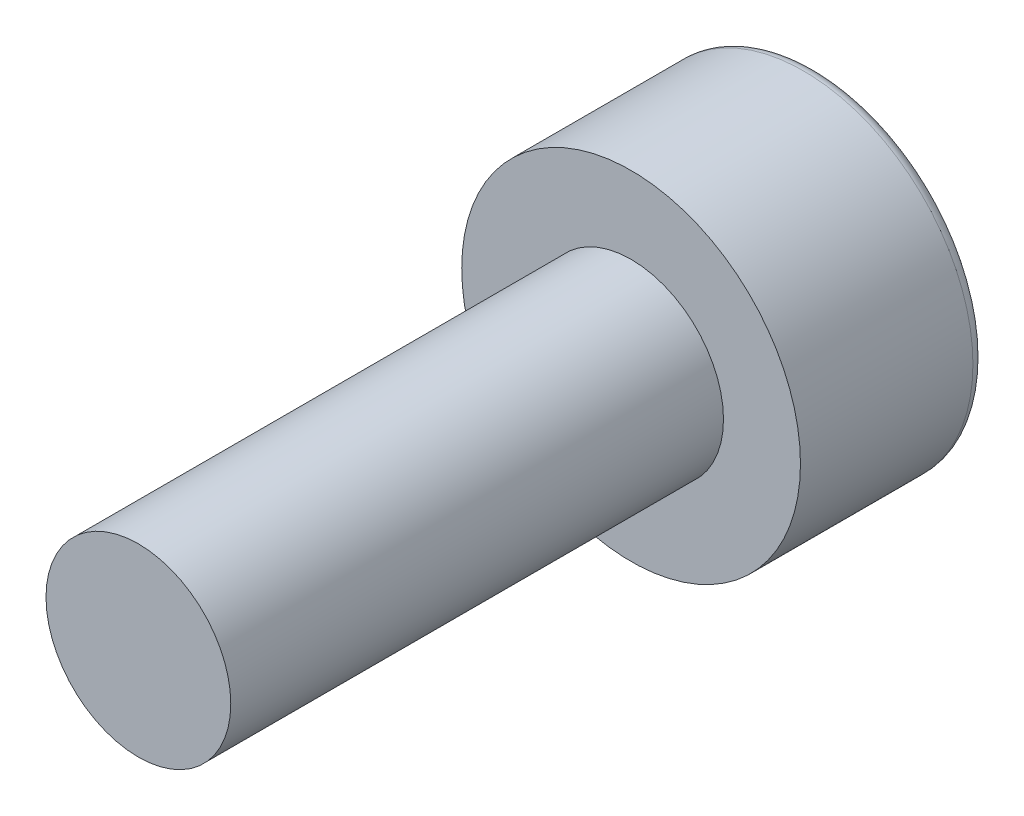
ISO-10303-21;
HEADER;
FILE_DESCRIPTION(('STEP AP214'),'2;1');
FILE_NAME('part.step','',(''),(''),'','','');
FILE_SCHEMA(('AUTOMOTIVE_DESIGN { 1 0 10303 214 1 1 1 1 }'));
ENDSEC;
DATA;
#1=APPLICATION_CONTEXT('core data for automotive mechanical design processes');
#2=APPLICATION_PROTOCOL_DEFINITION('international standard','automotive_design',2000,#1);
#3=PRODUCT_CONTEXT('',#1,'mechanical');
#4=PRODUCT('Part','Part','',(#3));
#5=PRODUCT_RELATED_PRODUCT_CATEGORY('part','',(#4));
#6=PRODUCT_DEFINITION_FORMATION('','',#4);
#7=PRODUCT_DEFINITION_CONTEXT('part definition',#1,'design');
#8=PRODUCT_DEFINITION('design','',#6,#7);
#9=PRODUCT_DEFINITION_SHAPE('','',#8);
#10=(LENGTH_UNIT() NAMED_UNIT(*) SI_UNIT(.MILLI.,.METRE.));
#11=(NAMED_UNIT(*) PLANE_ANGLE_UNIT() SI_UNIT($,.RADIAN.));
#12=(NAMED_UNIT(*) SI_UNIT($,.STERADIAN.) SOLID_ANGLE_UNIT());
#13=UNCERTAINTY_MEASURE_WITH_UNIT(LENGTH_MEASURE(1.E-05),#10,'distance_accuracy_value','');
#14=(GEOMETRIC_REPRESENTATION_CONTEXT(3) GLOBAL_UNCERTAINTY_ASSIGNED_CONTEXT((#13)) GLOBAL_UNIT_ASSIGNED_CONTEXT((#10,
#11,#12)) REPRESENTATION_CONTEXT('',''));
#15=CARTESIAN_POINT('',(0.,0.,0.));
#16=DIRECTION('',(0.,0.,1.));
#17=DIRECTION('',(1.,0.,0.));
#18=AXIS2_PLACEMENT_3D('',#15,#16,#17);
#19=CARTESIAN_POINT('',(0.,0.,0.));
#20=DIRECTION('',(0.,0.,-1.));
#21=DIRECTION('',(1.,0.,0.));
#22=AXIS2_PLACEMENT_3D('',#19,#20,#21);
#23=PLANE('',#22);
#24=CARTESIAN_POINT('',(0.,0.,0.));
#25=DIRECTION('',(0.,0.,1.));
#26=DIRECTION('',(1.,0.,0.));
#27=AXIS2_PLACEMENT_3D('',#24,#25,#26);
#28=CIRCLE('',#27,2.75);
#29=CARTESIAN_POINT('',(2.75,0.,0.));
#30=VERTEX_POINT('',#29);
#31=EDGE_CURVE('E127',#30,#30,#28,.T.);
#32=ORIENTED_EDGE('',*,*,#31,.T.);
#33=EDGE_LOOP('',(#32));
#34=FACE_BOUND('',#33,.T.);
#35=CARTESIAN_POINT('',(0.,0.,0.));
#36=DIRECTION('',(0.,0.,1.));
#37=DIRECTION('',(1.,0.,0.));
#38=AXIS2_PLACEMENT_3D('',#35,#36,#37);
#39=CIRCLE('',#38,1.5);
#40=CARTESIAN_POINT('',(1.5,0.,0.));
#41=VERTEX_POINT('',#40);
#42=EDGE_CURVE('E130',#41,#41,#39,.F.);
#43=ORIENTED_EDGE('',*,*,#42,.T.);
#44=EDGE_LOOP('',(#43));
#45=FACE_BOUND('',#44,.T.);
#46=ADVANCED_FACE('F37',(#34,#45),#23,.F.);
#47=CARTESIAN_POINT('',(0.,0.,-3.));
#48=DIRECTION('',(0.,0.,1.));
#49=DIRECTION('',(-1.,0.,0.));
#50=AXIS2_PLACEMENT_3D('',#47,#48,#49);
#51=CYLINDRICAL_SURFACE('',#50,2.75);
#52=CARTESIAN_POINT('',(0.,0.,-2.8));
#53=DIRECTION('',(0.,0.,1.));
#54=DIRECTION('',(1.,0.,0.));
#55=AXIS2_PLACEMENT_3D('',#52,#53,#54);
#56=CIRCLE('',#55,2.75);
#57=CARTESIAN_POINT('',(2.75,0.,-2.8));
#58=VERTEX_POINT('',#57);
#59=EDGE_CURVE('E11',#58,#58,#56,.F.);
#60=ORIENTED_EDGE('',*,*,#59,.F.);
#61=EDGE_LOOP('',(#60));
#62=FACE_BOUND('',#61,.T.);
#63=ORIENTED_EDGE('',*,*,#31,.F.);
#64=EDGE_LOOP('',(#63));
#65=FACE_BOUND('',#64,.T.);
#66=ADVANCED_FACE('F140',(#62,#65),#51,.T.);
#67=CARTESIAN_POINT('',(0.,0.,-3.));
#68=DIRECTION('',(0.,0.,-1.));
#69=DIRECTION('',(1.,0.,0.));
#70=AXIS2_PLACEMENT_3D('',#67,#68,#69);
#71=PLANE('',#70);
#72=CARTESIAN_POINT('',(0.,0.,-3.));
#73=DIRECTION('',(0.,0.,1.));
#74=DIRECTION('',(1.,0.,0.));
#75=AXIS2_PLACEMENT_3D('',#72,#73,#74);
#76=CIRCLE('',#75,2.55);
#77=CARTESIAN_POINT('',(2.55,0.,-3.));
#78=VERTEX_POINT('',#77);
#79=EDGE_CURVE('E45',#78,#78,#76,.T.);
#80=ORIENTED_EDGE('',*,*,#79,.F.);
#81=EDGE_LOOP('',(#80));
#82=FACE_BOUND('',#81,.T.);
#83=DIRECTION('',(0.258819045102521,-0.965925826289068,0.));
#84=VECTOR('',#83,1.);
#85=CARTESIAN_POINT('',(-1.39419383956301,0.373573113403356,-3.));
#86=LINE('',#85,#84);
#87=CARTESIAN_POINT('',(-1.39419383956301,0.373573113403356,-3.));
#88=VERTEX_POINT('',#87);
#89=CARTESIAN_POINT('',(-1.02062072615966,-1.02062072615966,-3.));
#90=VERTEX_POINT('',#89);
#91=EDGE_CURVE('E144',#88,#90,#86,.T.);
#92=ORIENTED_EDGE('',*,*,#91,.T.);
#93=DIRECTION('',(0.965925826289068,-0.258819045102521,0.));
#94=VECTOR('',#93,1.);
#95=CARTESIAN_POINT('',(-1.02062072615966,-1.02062072615966,-3.));
#96=LINE('',#95,#94);
#97=CARTESIAN_POINT('',(0.373573113403355,-1.39419383956301,-3.));
#98=VERTEX_POINT('',#97);
#99=EDGE_CURVE('E146',#90,#98,#96,.T.);
#100=ORIENTED_EDGE('',*,*,#99,.T.);
#101=DIRECTION('',(0.707106781186548,0.707106781186548,0.));
#102=VECTOR('',#101,1.);
#103=CARTESIAN_POINT('',(0.373573113403355,-1.39419383956301,-3.));
#104=LINE('',#103,#102);
#105=CARTESIAN_POINT('',(1.39419383956301,-0.373573113403355,-3.));
#106=VERTEX_POINT('',#105);
#107=EDGE_CURVE('E150',#98,#106,#104,.T.);
#108=ORIENTED_EDGE('',*,*,#107,.T.);
#109=DIRECTION('',(-0.258819045102521,0.965925826289068,0.));
#110=VECTOR('',#109,1.);
#111=CARTESIAN_POINT('',(1.39419383956301,-0.373573113403355,-3.));
#112=LINE('',#111,#110);
#113=CARTESIAN_POINT('',(1.02062072615966,1.02062072615966,-3.));
#114=VERTEX_POINT('',#113);
#115=EDGE_CURVE('E157',#106,#114,#112,.T.);
#116=ORIENTED_EDGE('',*,*,#115,.T.);
#117=DIRECTION('',(-0.965925826289068,0.258819045102521,0.));
#118=VECTOR('',#117,1.);
#119=CARTESIAN_POINT('',(1.02062072615966,1.02062072615966,-3.));
#120=LINE('',#119,#118);
#121=CARTESIAN_POINT('',(-0.373573113403355,1.39419383956301,-3.));
#122=VERTEX_POINT('',#121);
#123=EDGE_CURVE('E116',#114,#122,#120,.T.);
#124=ORIENTED_EDGE('',*,*,#123,.T.);
#125=DIRECTION('',(-0.707106781186548,-0.707106781186548,0.));
#126=VECTOR('',#125,1.);
#127=CARTESIAN_POINT('',(-0.373573113403355,1.39419383956301,-3.));
#128=LINE('',#127,#126);
#129=EDGE_CURVE('E147',#122,#88,#128,.T.);
#130=ORIENTED_EDGE('',*,*,#129,.T.);
#131=EDGE_LOOP('',(#92,#100,#108,#116,#124,#130));
#132=FACE_BOUND('',#131,.T.);
#133=ADVANCED_FACE('F136',(#82,#132),#71,.T.);
#134=CARTESIAN_POINT('',(-1.39419383956301,0.373573113403356,-1.7));
#135=DIRECTION('',(-0.965925826289068,-0.258819045102521,0.));
#136=DIRECTION('',(0.258819045102521,-0.965925826289068,0.));
#137=AXIS2_PLACEMENT_3D('',#134,#135,#136);
#138=PLANE('',#137);
#139=ORIENTED_EDGE('',*,*,#91,.F.);
#140=DIRECTION('',(0.,0.,-1.));
#141=VECTOR('',#140,1.);
#142=CARTESIAN_POINT('',(-1.39419383956301,0.373573113403356,-1.7));
#143=LINE('',#142,#141);
#144=CARTESIAN_POINT('',(-1.39419383956301,0.373573113403356,-1.7));
#145=VERTEX_POINT('',#144);
#146=EDGE_CURVE('E83',#145,#88,#143,.T.);
#147=ORIENTED_EDGE('',*,*,#146,.F.);
#148=DIRECTION('',(0.258819045102521,-0.965925826289068,0.));
#149=VECTOR('',#148,1.);
#150=CARTESIAN_POINT('',(-1.39419383956301,0.373573113403356,-1.7));
#151=LINE('',#150,#149);
#152=CARTESIAN_POINT('',(-1.02062072615966,-1.02062072615966,-1.7));
#153=VERTEX_POINT('',#152);
#154=EDGE_CURVE('E160',#145,#153,#151,.T.);
#155=ORIENTED_EDGE('',*,*,#154,.T.);
#156=DIRECTION('',(0.,0.,-1.));
#157=VECTOR('',#156,1.);
#158=CARTESIAN_POINT('',(-1.02062072615966,-1.02062072615966,-1.7));
#159=LINE('',#158,#157);
#160=EDGE_CURVE('E52',#153,#90,#159,.T.);
#161=ORIENTED_EDGE('',*,*,#160,.T.);
#162=EDGE_LOOP('',(#139,#147,#155,#161));
#163=FACE_BOUND('',#162,.T.);
#164=ADVANCED_FACE('F139',(#163),#138,.F.);
#165=CARTESIAN_POINT('',(-0.373573113403355,1.39419383956301,-1.7));
#166=DIRECTION('',(-0.707106781186548,0.707106781186548,0.));
#167=DIRECTION('',(-0.707106781186548,-0.707106781186548,0.));
#168=AXIS2_PLACEMENT_3D('',#165,#166,#167);
#169=PLANE('',#168);
#170=ORIENTED_EDGE('',*,*,#129,.F.);
#171=DIRECTION('',(0.,0.,-1.));
#172=VECTOR('',#171,1.);
#173=CARTESIAN_POINT('',(-0.373573113403355,1.39419383956301,-1.7));
#174=LINE('',#173,#172);
#175=CARTESIAN_POINT('',(-0.373573113403355,1.39419383956301,-1.7));
#176=VERTEX_POINT('',#175);
#177=EDGE_CURVE('E118',#176,#122,#174,.T.);
#178=ORIENTED_EDGE('',*,*,#177,.F.);
#179=DIRECTION('',(-0.707106781186548,-0.707106781186548,0.));
#180=VECTOR('',#179,1.);
#181=CARTESIAN_POINT('',(-0.373573113403355,1.39419383956301,-1.7));
#182=LINE('',#181,#180);
#183=EDGE_CURVE('E61',#176,#145,#182,.T.);
#184=ORIENTED_EDGE('',*,*,#183,.T.);
#185=ORIENTED_EDGE('',*,*,#146,.T.);
#186=EDGE_LOOP('',(#170,#178,#184,#185));
#187=FACE_BOUND('',#186,.T.);
#188=ADVANCED_FACE('F189',(#187),#169,.F.);
#189=CARTESIAN_POINT('',(1.02062072615966,1.02062072615966,-1.7));
#190=DIRECTION('',(0.258819045102521,0.965925826289068,0.));
#191=DIRECTION('',(-0.965925826289068,0.258819045102521,0.));
#192=AXIS2_PLACEMENT_3D('',#189,#190,#191);
#193=PLANE('',#192);
#194=ORIENTED_EDGE('',*,*,#123,.F.);
#195=DIRECTION('',(0.,0.,-1.));
#196=VECTOR('',#195,1.);
#197=CARTESIAN_POINT('',(1.02062072615966,1.02062072615966,-1.7));
#198=LINE('',#197,#196);
#199=CARTESIAN_POINT('',(1.02062072615966,1.02062072615966,-1.7));
#200=VERTEX_POINT('',#199);
#201=EDGE_CURVE('E105',#200,#114,#198,.T.);
#202=ORIENTED_EDGE('',*,*,#201,.F.);
#203=DIRECTION('',(-0.965925826289068,0.258819045102521,0.));
#204=VECTOR('',#203,1.);
#205=CARTESIAN_POINT('',(1.02062072615966,1.02062072615966,-1.7));
#206=LINE('',#205,#204);
#207=EDGE_CURVE('E108',#200,#176,#206,.T.);
#208=ORIENTED_EDGE('',*,*,#207,.T.);
#209=ORIENTED_EDGE('',*,*,#177,.T.);
#210=EDGE_LOOP('',(#194,#202,#208,#209));
#211=FACE_BOUND('',#210,.T.);
#212=ADVANCED_FACE('F114',(#211),#193,.F.);
#213=CARTESIAN_POINT('',(1.39419383956301,-0.373573113403355,-1.7));
#214=DIRECTION('',(0.965925826289068,0.258819045102521,0.));
#215=DIRECTION('',(-0.258819045102521,0.965925826289068,0.));
#216=AXIS2_PLACEMENT_3D('',#213,#214,#215);
#217=PLANE('',#216);
#218=ORIENTED_EDGE('',*,*,#115,.F.);
#219=DIRECTION('',(0.,0.,-1.));
#220=VECTOR('',#219,1.);
#221=CARTESIAN_POINT('',(1.39419383956301,-0.373573113403355,-1.7));
#222=LINE('',#221,#220);
#223=CARTESIAN_POINT('',(1.39419383956301,-0.373573113403355,-1.7));
#224=VERTEX_POINT('',#223);
#225=EDGE_CURVE('E107',#224,#106,#222,.T.);
#226=ORIENTED_EDGE('',*,*,#225,.F.);
#227=DIRECTION('',(-0.258819045102521,0.965925826289068,0.));
#228=VECTOR('',#227,1.);
#229=CARTESIAN_POINT('',(1.39419383956301,-0.373573113403355,-1.7));
#230=LINE('',#229,#228);
#231=EDGE_CURVE('E100',#224,#200,#230,.T.);
#232=ORIENTED_EDGE('',*,*,#231,.T.);
#233=ORIENTED_EDGE('',*,*,#201,.T.);
#234=EDGE_LOOP('',(#218,#226,#232,#233));
#235=FACE_BOUND('',#234,.T.);
#236=ADVANCED_FACE('F103',(#235),#217,.F.);
#237=CARTESIAN_POINT('',(0.373573113403355,-1.39419383956301,-1.7));
#238=DIRECTION('',(0.707106781186548,-0.707106781186548,0.));
#239=DIRECTION('',(0.707106781186548,0.707106781186548,0.));
#240=AXIS2_PLACEMENT_3D('',#237,#238,#239);
#241=PLANE('',#240);
#242=ORIENTED_EDGE('',*,*,#107,.F.);
#243=DIRECTION('',(0.,0.,-1.));
#244=VECTOR('',#243,1.);
#245=CARTESIAN_POINT('',(0.373573113403355,-1.39419383956301,-1.7));
#246=LINE('',#245,#244);
#247=CARTESIAN_POINT('',(0.373573113403355,-1.39419383956301,-1.7));
#248=VERTEX_POINT('',#247);
#249=EDGE_CURVE('E121',#248,#98,#246,.T.);
#250=ORIENTED_EDGE('',*,*,#249,.F.);
#251=DIRECTION('',(0.707106781186548,0.707106781186548,0.));
#252=VECTOR('',#251,1.);
#253=CARTESIAN_POINT('',(0.373573113403355,-1.39419383956301,-1.7));
#254=LINE('',#253,#252);
#255=EDGE_CURVE('E109',#248,#224,#254,.T.);
#256=ORIENTED_EDGE('',*,*,#255,.T.);
#257=ORIENTED_EDGE('',*,*,#225,.T.);
#258=EDGE_LOOP('',(#242,#250,#256,#257));
#259=FACE_BOUND('',#258,.T.);
#260=ADVANCED_FACE('F167',(#259),#241,.F.);
#261=CARTESIAN_POINT('',(-1.02062072615966,-1.02062072615966,-1.7));
#262=DIRECTION('',(-0.258819045102521,-0.965925826289068,0.));
#263=DIRECTION('',(0.965925826289068,-0.258819045102521,0.));
#264=AXIS2_PLACEMENT_3D('',#261,#262,#263);
#265=PLANE('',#264);
#266=ORIENTED_EDGE('',*,*,#99,.F.);
#267=ORIENTED_EDGE('',*,*,#160,.F.);
#268=DIRECTION('',(0.965925826289068,-0.258819045102521,0.));
#269=VECTOR('',#268,1.);
#270=CARTESIAN_POINT('',(-1.02062072615966,-1.02062072615966,-1.7));
#271=LINE('',#270,#269);
#272=EDGE_CURVE('E91',#153,#248,#271,.T.);
#273=ORIENTED_EDGE('',*,*,#272,.T.);
#274=ORIENTED_EDGE('',*,*,#249,.T.);
#275=EDGE_LOOP('',(#266,#267,#273,#274));
#276=FACE_BOUND('',#275,.T.);
#277=ADVANCED_FACE('F169',(#276),#265,.F.);
#278=CARTESIAN_POINT('',(0.,0.,-1.7));
#279=DIRECTION('',(0.,0.,-1.));
#280=DIRECTION('',(1.,0.,0.));
#281=AXIS2_PLACEMENT_3D('',#278,#279,#280);
#282=PLANE('',#281);
#283=ORIENTED_EDGE('',*,*,#154,.F.);
#284=ORIENTED_EDGE('',*,*,#183,.F.);
#285=ORIENTED_EDGE('',*,*,#207,.F.);
#286=ORIENTED_EDGE('',*,*,#231,.F.);
#287=ORIENTED_EDGE('',*,*,#255,.F.);
#288=ORIENTED_EDGE('',*,*,#272,.F.);
#289=EDGE_LOOP('',(#283,#284,#285,#286,#287,#288));
#290=FACE_BOUND('',#289,.T.);
#291=ADVANCED_FACE('F111',(#290),#282,.T.);
#292=CARTESIAN_POINT('',(0.,0.,8.));
#293=DIRECTION('',(0.,0.,-1.));
#294=DIRECTION('',(1.,0.,0.));
#295=AXIS2_PLACEMENT_3D('',#292,#293,#294);
#296=CYLINDRICAL_SURFACE('',#295,1.5);
#297=CARTESIAN_POINT('',(0.,0.,8.));
#298=DIRECTION('',(0.,0.,-1.));
#299=DIRECTION('',(-1.,0.,0.));
#300=AXIS2_PLACEMENT_3D('',#297,#298,#299);
#301=CIRCLE('',#300,1.5);
#302=CARTESIAN_POINT('',(-1.5,0.,8.));
#303=VERTEX_POINT('',#302);
#304=EDGE_CURVE('E148',#303,#303,#301,.T.);
#305=ORIENTED_EDGE('',*,*,#304,.T.);
#306=EDGE_LOOP('',(#305));
#307=FACE_BOUND('',#306,.T.);
#308=ORIENTED_EDGE('',*,*,#42,.F.);
#309=EDGE_LOOP('',(#308));
#310=FACE_BOUND('',#309,.T.);
#311=ADVANCED_FACE('F176',(#307,#310),#296,.T.);
#312=CARTESIAN_POINT('',(0.,0.,8.));
#313=DIRECTION('',(0.,0.,1.));
#314=DIRECTION('',(-1.,0.,0.));
#315=AXIS2_PLACEMENT_3D('',#312,#313,#314);
#316=PLANE('',#315);
#317=ORIENTED_EDGE('',*,*,#304,.F.);
#318=EDGE_LOOP('',(#317));
#319=FACE_BOUND('',#318,.T.);
#320=ADVANCED_FACE('F228',(#319),#316,.T.);
#321=CARTESIAN_POINT('',(0.,0.,-2.8));
#322=DIRECTION('',(0.,0.,-1.));
#323=DIRECTION('',(1.,0.,0.));
#324=AXIS2_PLACEMENT_3D('',#321,#322,#323);
#325=TOROIDAL_SURFACE('',#324,2.55,0.2);
#326=ORIENTED_EDGE('',*,*,#59,.T.);
#327=EDGE_LOOP('',(#326));
#328=FACE_BOUND('',#327,.T.);
#329=ORIENTED_EDGE('',*,*,#79,.T.);
#330=EDGE_LOOP('',(#329));
#331=FACE_BOUND('',#330,.T.);
#332=ADVANCED_FACE('F39',(#328,#331),#325,.T.);
#333=CLOSED_SHELL('',(#46,#66,#133,#164,#188,#212,#236,#260,#277,#291,#311,#320,#332));
#334=MANIFOLD_SOLID_BREP('B2',#333);
#335=ADVANCED_BREP_SHAPE_REPRESENTATION('',(#18,#334),#14);
#336=SHAPE_DEFINITION_REPRESENTATION(#9,#335);
ENDSEC;
END-ISO-10303-21;
